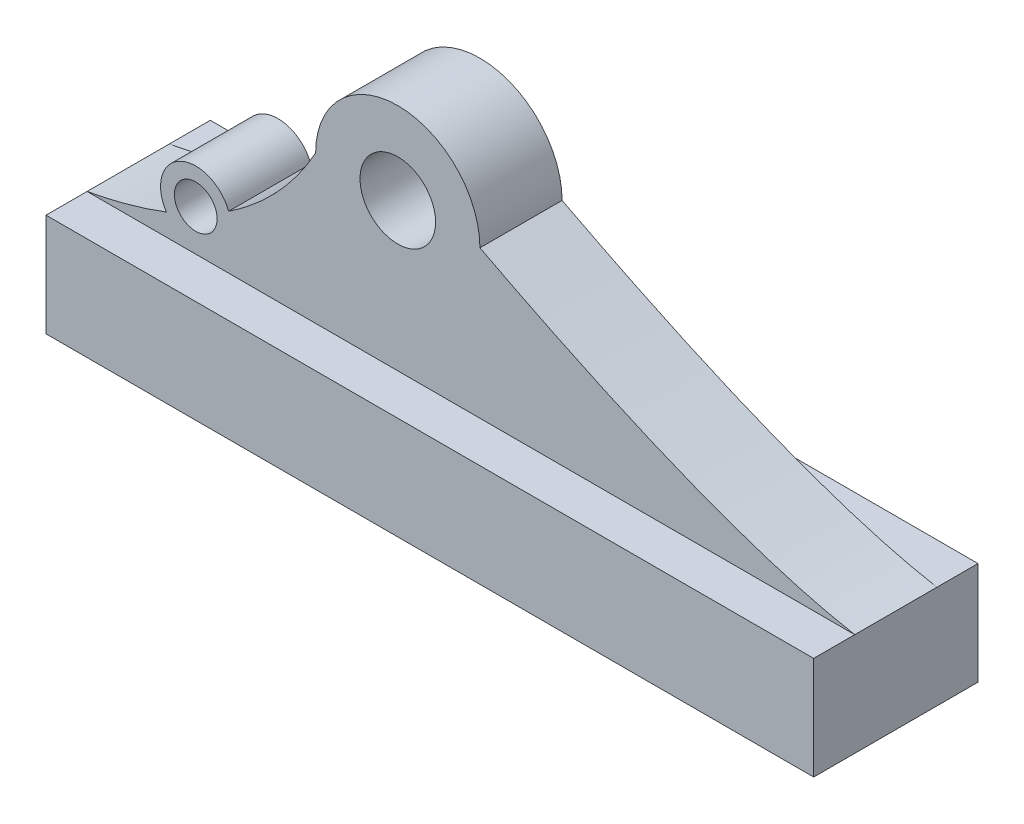
ISO-10303-21;
HEADER;
FILE_DESCRIPTION(('STEP AP214'),'2;1');
FILE_NAME('part.step','',(''),(''),'','','');
FILE_SCHEMA(('AUTOMOTIVE_DESIGN { 1 0 10303 214 1 1 1 1 }'));
ENDSEC;
DATA;
#1=APPLICATION_CONTEXT('core data for automotive mechanical design processes');
#2=APPLICATION_PROTOCOL_DEFINITION('international standard','automotive_design',2000,#1);
#3=PRODUCT_CONTEXT('',#1,'mechanical');
#4=PRODUCT('Part','Part','',(#3));
#5=PRODUCT_RELATED_PRODUCT_CATEGORY('part','',(#4));
#6=PRODUCT_DEFINITION_FORMATION('','',#4);
#7=PRODUCT_DEFINITION_CONTEXT('part definition',#1,'design');
#8=PRODUCT_DEFINITION('design','',#6,#7);
#9=PRODUCT_DEFINITION_SHAPE('','',#8);
#10=(LENGTH_UNIT() NAMED_UNIT(*) SI_UNIT(.MILLI.,.METRE.));
#11=(NAMED_UNIT(*) PLANE_ANGLE_UNIT() SI_UNIT($,.RADIAN.));
#12=(NAMED_UNIT(*) SI_UNIT($,.STERADIAN.) SOLID_ANGLE_UNIT());
#13=UNCERTAINTY_MEASURE_WITH_UNIT(LENGTH_MEASURE(1.E-05),#10,'distance_accuracy_value','');
#14=(GEOMETRIC_REPRESENTATION_CONTEXT(3) GLOBAL_UNCERTAINTY_ASSIGNED_CONTEXT((#13)) GLOBAL_UNIT_ASSIGNED_CONTEXT((#10,
#11,#12)) REPRESENTATION_CONTEXT('',''));
#15=CARTESIAN_POINT('',(0.,0.,0.));
#16=DIRECTION('',(0.,0.,1.));
#17=DIRECTION('',(1.,0.,0.));
#18=AXIS2_PLACEMENT_3D('',#15,#16,#17);
#19=CARTESIAN_POINT('',(-2.50345023355484,-0.00158449490953241,1.25));
#20=CARTESIAN_POINT('',(-4.49628934550769,-3.58939728752983,1.25));
#21=CARTESIAN_POINT('',(-9.45800220212407,-4.49245139236392,1.25));
#22=B_SPLINE_CURVE_WITH_KNOTS('',2,(#19,#20,#21),.UNSPECIFIED.,.F.,.F.,(3,3),(0.,1.),.UNSPECIFIED.);
#23=DIRECTION('',(0.,0.,-1.));
#24=VECTOR('',#23,1.);
#25=SURFACE_OF_LINEAR_EXTRUSION('',#22,#24);
#26=CARTESIAN_POINT('',(-2.50345023355484,-0.00158449490953241,-1.25));
#27=CARTESIAN_POINT('',(-4.49628934550769,-3.58939728752983,-1.25));
#28=CARTESIAN_POINT('',(-9.45800220212407,-4.49245139236392,-1.25));
#29=B_SPLINE_CURVE_WITH_KNOTS('',2,(#26,#27,#28),.UNSPECIFIED.,.F.,.F.,(3,3),(0.,1.),.UNSPECIFIED.);
#30=CARTESIAN_POINT('',(-2.50345023355484,-0.00158449490953415,-1.25));
#31=VERTEX_POINT('',#30);
#32=CARTESIAN_POINT('',(-5.15003592649698,-2.86032441359605,-1.25));
#33=VERTEX_POINT('',#32);
#34=EDGE_CURVE('E137',#31,#33,#29,.T.);
#35=ORIENTED_EDGE('',*,*,#34,.T.);
#36=DIRECTION('',(0.,0.,-1.));
#37=VECTOR('',#36,1.);
#38=CARTESIAN_POINT('',(-5.15003592649698,-2.86032441359606,1.25));
#39=LINE('',#38,#37);
#40=CARTESIAN_POINT('',(-5.15003592649698,-2.86032441359605,1.25));
#41=VERTEX_POINT('',#40);
#42=EDGE_CURVE('E11',#33,#41,#39,.F.);
#43=ORIENTED_EDGE('',*,*,#42,.T.);
#44=CARTESIAN_POINT('',(-2.50345023355484,-0.00158449490953415,1.25));
#45=VERTEX_POINT('',#44);
#46=EDGE_CURVE('E135',#45,#41,#22,.T.);
#47=ORIENTED_EDGE('',*,*,#46,.F.);
#48=DIRECTION('',(0.,0.,-1.));
#49=VECTOR('',#48,1.);
#50=CARTESIAN_POINT('',(-2.50345023355484,-0.00158449490953415,1.25));
#51=LINE('',#50,#49);
#52=EDGE_CURVE('E146',#45,#31,#51,.T.);
#53=ORIENTED_EDGE('',*,*,#52,.T.);
#54=EDGE_LOOP('',(#35,#43,#47,#53));
#55=FACE_BOUND('',#54,.T.);
#56=ADVANCED_FACE('F39',(#55),#25,.F.);
#57=CARTESIAN_POINT('',(-5.23850778167357,-2.91820761558328,1.25));
#58=DIRECTION('',(0.,0.,-1.));
#59=DIRECTION('',(-1.,0.,0.));
#60=AXIS2_PLACEMENT_3D('',#57,#58,#59);
#61=PLANE('',#60);
#62=CARTESIAN_POINT('',(-6.15167168991387,-3.239035274185,1.25));
#63=DIRECTION('',(0.,0.,-1.));
#64=DIRECTION('',(-1.,0.,0.));
#65=AXIS2_PLACEMENT_3D('',#62,#63,#64);
#66=CIRCLE('',#65,0.65);
#67=CARTESIAN_POINT('',(-6.80167168991387,-3.239035274185,1.25));
#68=VERTEX_POINT('',#67);
#69=EDGE_CURVE('E242',#68,#68,#66,.T.);
#70=ORIENTED_EDGE('',*,*,#69,.T.);
#71=EDGE_LOOP('',(#70));
#72=FACE_BOUND('',#71,.T.);
#73=CARTESIAN_POINT('',(-0.00345023355484148,-0.00158449490953415,1.25));
#74=DIRECTION('',(0.,0.,1.));
#75=DIRECTION('',(1.,0.,0.));
#76=AXIS2_PLACEMENT_3D('',#73,#74,#75);
#77=CIRCLE('',#76,1.15);
#78=CARTESIAN_POINT('',(1.14654976644516,-0.00158449490953415,1.25));
#79=VERTEX_POINT('',#78);
#80=EDGE_CURVE('E191',#79,#79,#77,.T.);
#81=ORIENTED_EDGE('',*,*,#80,.F.);
#82=EDGE_LOOP('',(#81));
#83=FACE_BOUND('',#82,.T.);
#84=ORIENTED_EDGE('',*,*,#46,.T.);
#85=CARTESIAN_POINT('',(-6.15167168991387,-3.239035274185,1.25));
#86=DIRECTION('',(0.,0.,-1.));
#87=DIRECTION('',(-1.,0.,0.));
#88=AXIS2_PLACEMENT_3D('',#85,#86,#87);
#89=CIRCLE('',#88,1.07083897878427);
#90=CARTESIAN_POINT('',(-7.04554781617087,-3.82868058230833,1.25));
#91=VERTEX_POINT('',#90);
#92=EDGE_CURVE('E56',#41,#91,#89,.F.);
#93=ORIENTED_EDGE('',*,*,#92,.T.);
#94=CARTESIAN_POINT('',(-9.45800220212407,-4.49245139236392,1.25));
#95=VERTEX_POINT('',#94);
#96=EDGE_CURVE('E141',#91,#95,#22,.T.);
#97=ORIENTED_EDGE('',*,*,#96,.T.);
#98=DIRECTION('',(-1.,0.,0.));
#99=VECTOR('',#98,1.);
#100=CARTESIAN_POINT('',(-5.23850778167357,-4.49245139236392,1.25));
#101=LINE('',#100,#99);
#102=CARTESIAN_POINT('',(13.9026549231835,-4.49245139236392,1.25));
#103=VERTEX_POINT('',#102);
#104=EDGE_CURVE('E85',#103,#95,#101,.T.);
#105=ORIENTED_EDGE('',*,*,#104,.F.);
#106=CARTESIAN_POINT('',(13.9026549231835,-4.49245139236392,1.25));
#107=CARTESIAN_POINT('',(9.69601190799114,-3.74460374521861,1.25));
#108=CARTESIAN_POINT('',(2.49654976644516,-0.00158449490953415,1.25));
#109=B_SPLINE_CURVE_WITH_KNOTS('',2,(#106,#107,#108),.UNSPECIFIED.,.F.,.F.,(3,3),(0.,1.),.UNSPECIFIED.);
#110=CARTESIAN_POINT('',(2.49654976644516,-0.00158449490953415,1.25));
#111=VERTEX_POINT('',#110);
#112=EDGE_CURVE('E178',#103,#111,#109,.T.);
#113=ORIENTED_EDGE('',*,*,#112,.T.);
#114=CARTESIAN_POINT('',(-0.00345023355484148,-0.00158449490953415,1.25));
#115=DIRECTION('',(0.,0.,1.));
#116=DIRECTION('',(1.,0.,0.));
#117=AXIS2_PLACEMENT_3D('',#114,#115,#116);
#118=CIRCLE('',#117,2.5);
#119=EDGE_CURVE('E63',#111,#45,#118,.T.);
#120=ORIENTED_EDGE('',*,*,#119,.T.);
#121=EDGE_LOOP('',(#84,#93,#97,#105,#113,#120));
#122=FACE_BOUND('',#121,.T.);
#123=ADVANCED_FACE('F138',(#72,#83,#122),#61,.F.);
#124=CARTESIAN_POINT('',(-5.23850778167357,-2.91820761558328,-1.25));
#125=DIRECTION('',(0.,0.,-1.));
#126=DIRECTION('',(-1.,0.,0.));
#127=AXIS2_PLACEMENT_3D('',#124,#125,#126);
#128=PLANE('',#127);
#129=CARTESIAN_POINT('',(-6.15167168991387,-3.239035274185,-1.25));
#130=DIRECTION('',(0.,0.,-1.));
#131=DIRECTION('',(-1.,0.,0.));
#132=AXIS2_PLACEMENT_3D('',#129,#130,#131);
#133=CIRCLE('',#132,0.65);
#134=CARTESIAN_POINT('',(-6.80167168991387,-3.239035274185,-1.25));
#135=VERTEX_POINT('',#134);
#136=EDGE_CURVE('E43',#135,#135,#133,.T.);
#137=ORIENTED_EDGE('',*,*,#136,.F.);
#138=EDGE_LOOP('',(#137));
#139=FACE_BOUND('',#138,.T.);
#140=CARTESIAN_POINT('',(-7.04554781617072,-3.82868058230827,-1.25));
#141=VERTEX_POINT('',#140);
#142=CARTESIAN_POINT('',(-9.45800220212407,-4.49245139236392,-1.25));
#143=VERTEX_POINT('',#142);
#144=EDGE_CURVE('E81',#141,#143,#29,.T.);
#145=ORIENTED_EDGE('',*,*,#144,.F.);
#146=CARTESIAN_POINT('',(-6.15167168991387,-3.239035274185,-1.25));
#147=DIRECTION('',(0.,0.,-1.));
#148=DIRECTION('',(-1.,0.,0.));
#149=AXIS2_PLACEMENT_3D('',#146,#147,#148);
#150=CIRCLE('',#149,1.07083897878427);
#151=EDGE_CURVE('E129',#141,#33,#150,.T.);
#152=ORIENTED_EDGE('',*,*,#151,.T.);
#153=ORIENTED_EDGE('',*,*,#34,.F.);
#154=CARTESIAN_POINT('',(-0.00345023355484148,-0.00158449490953415,-1.25));
#155=DIRECTION('',(0.,0.,1.));
#156=DIRECTION('',(1.,0.,0.));
#157=AXIS2_PLACEMENT_3D('',#154,#155,#156);
#158=CIRCLE('',#157,2.5);
#159=CARTESIAN_POINT('',(2.49654976644516,-0.00158449490953415,-1.25));
#160=VERTEX_POINT('',#159);
#161=EDGE_CURVE('E429',#160,#31,#158,.T.);
#162=ORIENTED_EDGE('',*,*,#161,.F.);
#163=CARTESIAN_POINT('',(13.9026549231835,-4.49245139236392,-1.25));
#164=CARTESIAN_POINT('',(9.69601190799114,-3.74460374521861,-1.25));
#165=CARTESIAN_POINT('',(2.49654976644516,-0.00158449490953415,-1.25));
#166=B_SPLINE_CURVE_WITH_KNOTS('',2,(#163,#164,#165),.UNSPECIFIED.,.F.,.F.,(3,3),(0.,1.),.UNSPECIFIED.);
#167=CARTESIAN_POINT('',(13.9026549231835,-4.49245139236392,-1.25));
#168=VERTEX_POINT('',#167);
#169=EDGE_CURVE('E154',#168,#160,#166,.T.);
#170=ORIENTED_EDGE('',*,*,#169,.F.);
#171=DIRECTION('',(-1.,0.,0.));
#172=VECTOR('',#171,1.);
#173=CARTESIAN_POINT('',(-5.23850778167357,-4.49245139236392,-1.25));
#174=LINE('',#173,#172);
#175=EDGE_CURVE('E197',#168,#143,#174,.T.);
#176=ORIENTED_EDGE('',*,*,#175,.T.);
#177=EDGE_LOOP('',(#145,#152,#153,#162,#170,#176));
#178=FACE_BOUND('',#177,.T.);
#179=CARTESIAN_POINT('',(-0.00345023355484148,-0.00158449490953415,-1.25));
#180=DIRECTION('',(0.,0.,1.));
#181=DIRECTION('',(1.,0.,0.));
#182=AXIS2_PLACEMENT_3D('',#179,#180,#181);
#183=CIRCLE('',#182,1.15);
#184=CARTESIAN_POINT('',(1.14654976644516,-0.00158449490953415,-1.25));
#185=VERTEX_POINT('',#184);
#186=EDGE_CURVE('E184',#185,#185,#183,.T.);
#187=ORIENTED_EDGE('',*,*,#186,.T.);
#188=EDGE_LOOP('',(#187));
#189=FACE_BOUND('',#188,.T.);
#190=ADVANCED_FACE('F168',(#139,#178,#189),#128,.T.);
#191=CARTESIAN_POINT('',(-9.45800220212407,-7.62,1.25));
#192=DIRECTION('',(1.,0.,0.));
#193=DIRECTION('',(0.,0.,-1.));
#194=AXIS2_PLACEMENT_3D('',#191,#192,#193);
#195=PLANE('',#194);
#196=DIRECTION('',(0.,0.,-1.));
#197=VECTOR('',#196,1.);
#198=CARTESIAN_POINT('',(-9.45800220212407,-4.49245139236392,1.25));
#199=LINE('',#198,#197);
#200=EDGE_CURVE('E140',#95,#143,#199,.T.);
#201=ORIENTED_EDGE('',*,*,#200,.T.);
#202=DIRECTION('',(0.,0.,-1.));
#203=VECTOR('',#202,1.);
#204=CARTESIAN_POINT('',(-9.45800220212407,-4.49245139236392,2.5));
#205=LINE('',#204,#203);
#206=CARTESIAN_POINT('',(-9.45800220212407,-4.49245139236392,-2.5));
#207=VERTEX_POINT('',#206);
#208=EDGE_CURVE('E210',#143,#207,#205,.T.);
#209=ORIENTED_EDGE('',*,*,#208,.T.);
#210=DIRECTION('',(0.,-1.,0.));
#211=VECTOR('',#210,1.);
#212=CARTESIAN_POINT('',(-9.45800220212407,-4.49245139236392,-2.5));
#213=LINE('',#212,#211);
#214=CARTESIAN_POINT('',(-9.45800220212407,-7.62,-2.5));
#215=VERTEX_POINT('',#214);
#216=EDGE_CURVE('E128',#207,#215,#213,.T.);
#217=ORIENTED_EDGE('',*,*,#216,.T.);
#218=DIRECTION('',(0.,0.,-1.));
#219=VECTOR('',#218,1.);
#220=CARTESIAN_POINT('',(-9.45800220212407,-7.62,1.25));
#221=LINE('',#220,#219);
#222=CARTESIAN_POINT('',(-9.45800220212407,-7.62,2.5));
#223=VERTEX_POINT('',#222);
#224=EDGE_CURVE('E399',#223,#215,#221,.T.);
#225=ORIENTED_EDGE('',*,*,#224,.F.);
#226=DIRECTION('',(0.,-1.,0.));
#227=VECTOR('',#226,1.);
#228=CARTESIAN_POINT('',(-9.45800220212407,-4.49245139236392,2.5));
#229=LINE('',#228,#227);
#230=CARTESIAN_POINT('',(-9.45800220212407,-4.49245139236392,2.5));
#231=VERTEX_POINT('',#230);
#232=EDGE_CURVE('E215',#231,#223,#229,.T.);
#233=ORIENTED_EDGE('',*,*,#232,.F.);
#234=EDGE_CURVE('E206',#231,#95,#205,.T.);
#235=ORIENTED_EDGE('',*,*,#234,.T.);
#236=EDGE_LOOP('',(#201,#209,#217,#225,#233,#235));
#237=FACE_BOUND('',#236,.T.);
#238=ADVANCED_FACE('F41',(#237),#195,.F.);
#239=CARTESIAN_POINT('',(-9.45800220212407,-7.62,1.25));
#240=DIRECTION('',(0.,1.,0.));
#241=DIRECTION('',(0.,0.,1.));
#242=AXIS2_PLACEMENT_3D('',#239,#240,#241);
#243=PLANE('',#242);
#244=ORIENTED_EDGE('',*,*,#224,.T.);
#245=DIRECTION('',(1.,0.,0.));
#246=VECTOR('',#245,1.);
#247=CARTESIAN_POINT('',(-9.45800220212407,-7.62,-2.5));
#248=LINE('',#247,#246);
#249=CARTESIAN_POINT('',(13.9026549231835,-7.62,-2.5));
#250=VERTEX_POINT('',#249);
#251=EDGE_CURVE('E220',#215,#250,#248,.T.);
#252=ORIENTED_EDGE('',*,*,#251,.T.);
#253=DIRECTION('',(0.,0.,-1.));
#254=VECTOR('',#253,1.);
#255=CARTESIAN_POINT('',(13.9026549231835,-7.62,1.25));
#256=LINE('',#255,#254);
#257=CARTESIAN_POINT('',(13.9026549231835,-7.62,2.5));
#258=VERTEX_POINT('',#257);
#259=EDGE_CURVE('E403',#258,#250,#256,.T.);
#260=ORIENTED_EDGE('',*,*,#259,.F.);
#261=DIRECTION('',(1.,0.,0.));
#262=VECTOR('',#261,1.);
#263=CARTESIAN_POINT('',(-9.45800220212407,-7.62,2.5));
#264=LINE('',#263,#262);
#265=EDGE_CURVE('E233',#223,#258,#264,.T.);
#266=ORIENTED_EDGE('',*,*,#265,.F.);
#267=EDGE_LOOP('',(#244,#252,#260,#266));
#268=FACE_BOUND('',#267,.T.);
#269=ADVANCED_FACE('F288',(#268),#243,.F.);
#270=CARTESIAN_POINT('',(13.9026549231835,-7.62,1.25));
#271=DIRECTION('',(-1.,0.,0.));
#272=DIRECTION('',(0.,0.,1.));
#273=AXIS2_PLACEMENT_3D('',#270,#271,#272);
#274=PLANE('',#273);
#275=ORIENTED_EDGE('',*,*,#259,.T.);
#276=DIRECTION('',(0.,1.,0.));
#277=VECTOR('',#276,1.);
#278=CARTESIAN_POINT('',(13.9026549231835,-4.49245139236392,-2.5));
#279=LINE('',#278,#277);
#280=CARTESIAN_POINT('',(13.9026549231835,-4.49245139236392,-2.5));
#281=VERTEX_POINT('',#280);
#282=EDGE_CURVE('E216',#250,#281,#279,.T.);
#283=ORIENTED_EDGE('',*,*,#282,.T.);
#284=DIRECTION('',(0.,0.,-1.));
#285=VECTOR('',#284,1.);
#286=CARTESIAN_POINT('',(13.9026549231835,-4.49245139236392,2.5));
#287=LINE('',#286,#285);
#288=EDGE_CURVE('E205',#168,#281,#287,.T.);
#289=ORIENTED_EDGE('',*,*,#288,.F.);
#290=DIRECTION('',(0.,0.,-1.));
#291=VECTOR('',#290,1.);
#292=CARTESIAN_POINT('',(13.9026549231835,-4.49245139236392,1.25));
#293=LINE('',#292,#291);
#294=EDGE_CURVE('E407',#103,#168,#293,.T.);
#295=ORIENTED_EDGE('',*,*,#294,.F.);
#296=CARTESIAN_POINT('',(13.9026549231835,-4.49245139236392,2.5));
#297=VERTEX_POINT('',#296);
#298=EDGE_CURVE('E201',#297,#103,#287,.T.);
#299=ORIENTED_EDGE('',*,*,#298,.F.);
#300=DIRECTION('',(0.,1.,0.));
#301=VECTOR('',#300,1.);
#302=CARTESIAN_POINT('',(13.9026549231835,-4.49245139236392,2.5));
#303=LINE('',#302,#301);
#304=EDGE_CURVE('E230',#258,#297,#303,.T.);
#305=ORIENTED_EDGE('',*,*,#304,.F.);
#306=EDGE_LOOP('',(#275,#283,#289,#295,#299,#305));
#307=FACE_BOUND('',#306,.T.);
#308=ADVANCED_FACE('F176',(#307),#274,.F.);
#309=DIRECTION('',(0.,0.,-1.));
#310=VECTOR('',#309,1.);
#311=SURFACE_OF_LINEAR_EXTRUSION('',#109,#310);
#312=ORIENTED_EDGE('',*,*,#169,.T.);
#313=DIRECTION('',(0.,0.,-1.));
#314=VECTOR('',#313,1.);
#315=CARTESIAN_POINT('',(2.49654976644516,-0.00158449490953415,1.25));
#316=LINE('',#315,#314);
#317=EDGE_CURVE('E411',#111,#160,#316,.T.);
#318=ORIENTED_EDGE('',*,*,#317,.F.);
#319=ORIENTED_EDGE('',*,*,#112,.F.);
#320=ORIENTED_EDGE('',*,*,#294,.T.);
#321=EDGE_LOOP('',(#312,#318,#319,#320));
#322=FACE_BOUND('',#321,.T.);
#323=ADVANCED_FACE('F172',(#322),#311,.F.);
#324=CARTESIAN_POINT('',(-0.00345023355484148,-0.00158449490953415,1.25));
#325=DIRECTION('',(0.,0.,-1.));
#326=DIRECTION('',(-1.,0.,0.));
#327=AXIS2_PLACEMENT_3D('',#324,#325,#326);
#328=CYLINDRICAL_SURFACE('',#327,2.5);
#329=ORIENTED_EDGE('',*,*,#161,.T.);
#330=ORIENTED_EDGE('',*,*,#52,.F.);
#331=ORIENTED_EDGE('',*,*,#119,.F.);
#332=ORIENTED_EDGE('',*,*,#317,.T.);
#333=EDGE_LOOP('',(#329,#330,#331,#332));
#334=FACE_BOUND('',#333,.T.);
#335=ADVANCED_FACE('F167',(#334),#328,.T.);
#336=ORIENTED_EDGE('',*,*,#96,.F.);
#337=DIRECTION('',(0.,0.,-1.));
#338=VECTOR('',#337,1.);
#339=CARTESIAN_POINT('',(-7.04554781617072,-3.82868058230827,1.25));
#340=LINE('',#339,#338);
#341=EDGE_CURVE('E49',#91,#141,#340,.T.);
#342=ORIENTED_EDGE('',*,*,#341,.T.);
#343=ORIENTED_EDGE('',*,*,#144,.T.);
#344=ORIENTED_EDGE('',*,*,#200,.F.);
#345=EDGE_LOOP('',(#336,#342,#343,#344));
#346=FACE_BOUND('',#345,.T.);
#347=ADVANCED_FACE('F162',(#346),#25,.F.);
#348=CARTESIAN_POINT('',(-0.00345023355484148,-0.00158449490953415,1.25));
#349=DIRECTION('',(0.,0.,-1.));
#350=DIRECTION('',(-1.,0.,0.));
#351=AXIS2_PLACEMENT_3D('',#348,#349,#350);
#352=CYLINDRICAL_SURFACE('',#351,1.15);
#353=ORIENTED_EDGE('',*,*,#80,.T.);
#354=EDGE_LOOP('',(#353));
#355=FACE_BOUND('',#354,.T.);
#356=ORIENTED_EDGE('',*,*,#186,.F.);
#357=EDGE_LOOP('',(#356));
#358=FACE_BOUND('',#357,.T.);
#359=ADVANCED_FACE('F166',(#355,#358),#352,.F.);
#360=CARTESIAN_POINT('',(0.81,-7.62,-2.5));
#361=DIRECTION('',(0.,0.,1.));
#362=DIRECTION('',(1.,0.,0.));
#363=AXIS2_PLACEMENT_3D('',#360,#361,#362);
#364=PLANE('',#363);
#365=ORIENTED_EDGE('',*,*,#216,.F.);
#366=DIRECTION('',(-1.,0.,0.));
#367=VECTOR('',#366,1.);
#368=CARTESIAN_POINT('',(-9.45800220212407,-4.49245139236392,-2.5));
#369=LINE('',#368,#367);
#370=EDGE_CURVE('E211',#281,#207,#369,.T.);
#371=ORIENTED_EDGE('',*,*,#370,.F.);
#372=ORIENTED_EDGE('',*,*,#282,.F.);
#373=ORIENTED_EDGE('',*,*,#251,.F.);
#374=EDGE_LOOP('',(#365,#371,#372,#373));
#375=FACE_BOUND('',#374,.T.);
#376=ADVANCED_FACE('F260',(#375),#364,.F.);
#377=CARTESIAN_POINT('',(-9.45800220212407,-4.49245139236392,2.5));
#378=DIRECTION('',(0.,-1.,0.));
#379=DIRECTION('',(0.,0.,-1.));
#380=AXIS2_PLACEMENT_3D('',#377,#378,#379);
#381=PLANE('',#380);
#382=ORIENTED_EDGE('',*,*,#175,.F.);
#383=ORIENTED_EDGE('',*,*,#288,.T.);
#384=ORIENTED_EDGE('',*,*,#370,.T.);
#385=ORIENTED_EDGE('',*,*,#208,.F.);
#386=EDGE_LOOP('',(#382,#383,#384,#385));
#387=FACE_BOUND('',#386,.T.);
#388=ADVANCED_FACE('F266',(#387),#381,.F.);
#389=ORIENTED_EDGE('',*,*,#298,.T.);
#390=ORIENTED_EDGE('',*,*,#104,.T.);
#391=ORIENTED_EDGE('',*,*,#234,.F.);
#392=DIRECTION('',(-1.,0.,0.));
#393=VECTOR('',#392,1.);
#394=CARTESIAN_POINT('',(-9.45800220212407,-4.49245139236392,2.5));
#395=LINE('',#394,#393);
#396=EDGE_CURVE('E227',#297,#231,#395,.T.);
#397=ORIENTED_EDGE('',*,*,#396,.F.);
#398=EDGE_LOOP('',(#389,#390,#391,#397));
#399=FACE_BOUND('',#398,.T.);
#400=ADVANCED_FACE('F333',(#399),#381,.F.);
#401=CARTESIAN_POINT('',(0.81,-7.62,2.5));
#402=DIRECTION('',(0.,0.,1.));
#403=DIRECTION('',(1.,0.,0.));
#404=AXIS2_PLACEMENT_3D('',#401,#402,#403);
#405=PLANE('',#404);
#406=ORIENTED_EDGE('',*,*,#232,.T.);
#407=ORIENTED_EDGE('',*,*,#265,.T.);
#408=ORIENTED_EDGE('',*,*,#304,.T.);
#409=ORIENTED_EDGE('',*,*,#396,.T.);
#410=EDGE_LOOP('',(#406,#407,#408,#409));
#411=FACE_BOUND('',#410,.T.);
#412=ADVANCED_FACE('F343',(#411),#405,.T.);
#413=CARTESIAN_POINT('',(-6.15167168991387,-3.239035274185,4.27879001382895));
#414=DIRECTION('',(0.,0.,-1.));
#415=DIRECTION('',(-1.,0.,0.));
#416=AXIS2_PLACEMENT_3D('',#413,#414,#415);
#417=CYLINDRICAL_SURFACE('',#416,1.07083897878427);
#418=ORIENTED_EDGE('',*,*,#42,.F.);
#419=ORIENTED_EDGE('',*,*,#151,.F.);
#420=ORIENTED_EDGE('',*,*,#341,.F.);
#421=ORIENTED_EDGE('',*,*,#92,.F.);
#422=EDGE_LOOP('',(#418,#419,#420,#421));
#423=FACE_BOUND('',#422,.T.);
#424=ADVANCED_FACE('F124',(#423),#417,.T.);
#425=CARTESIAN_POINT('',(-6.15167168991387,-3.239035274185,2.5));
#426=DIRECTION('',(0.,0.,-1.));
#427=DIRECTION('',(-1.,0.,0.));
#428=AXIS2_PLACEMENT_3D('',#425,#426,#427);
#429=CYLINDRICAL_SURFACE('',#428,0.65);
#430=ORIENTED_EDGE('',*,*,#136,.T.);
#431=EDGE_LOOP('',(#430));
#432=FACE_BOUND('',#431,.T.);
#433=ORIENTED_EDGE('',*,*,#69,.F.);
#434=EDGE_LOOP('',(#433));
#435=FACE_BOUND('',#434,.T.);
#436=ADVANCED_FACE('F251',(#432,#435),#429,.F.);
#437=CLOSED_SHELL('',(#56,#123,#190,#238,#269,#308,#323,#335,#347,#359,#376,#388,#400,#412,#424,#436));
#438=MANIFOLD_SOLID_BREP('B2',#437);
#439=ADVANCED_BREP_SHAPE_REPRESENTATION('',(#18,#438),#14);
#440=SHAPE_DEFINITION_REPRESENTATION(#9,#439);
ENDSEC;
END-ISO-10303-21;
